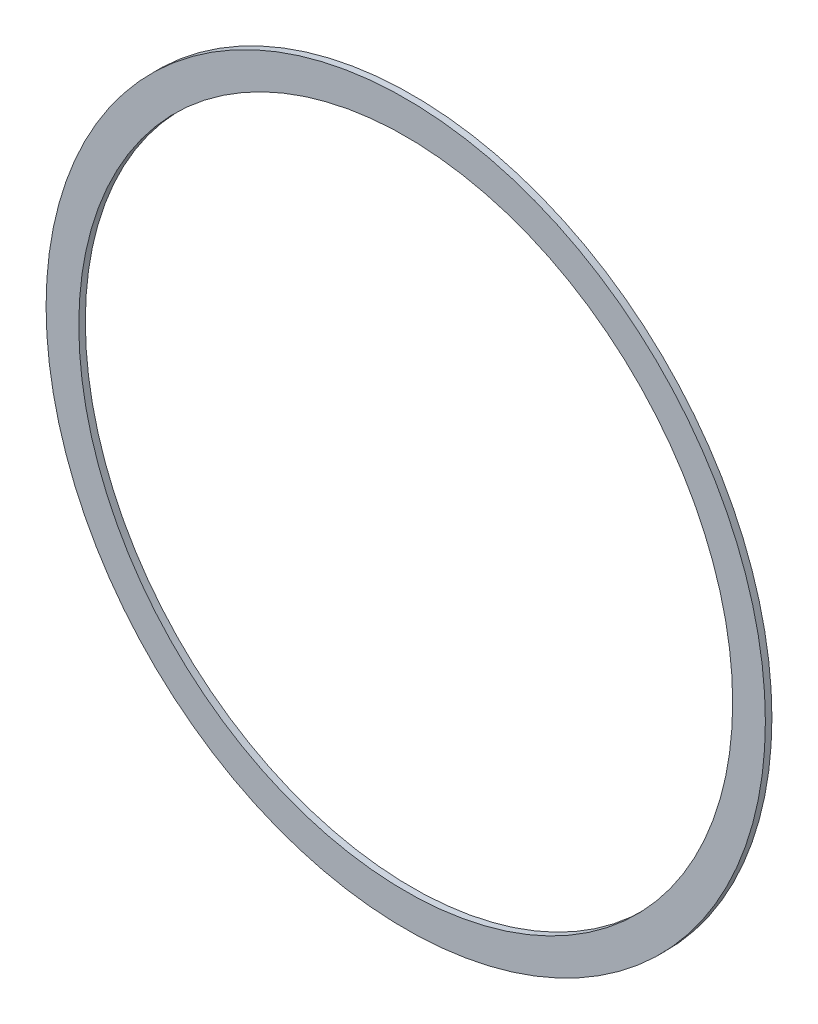
ISO-10303-21;
HEADER;
FILE_DESCRIPTION(('STEP AP214'),'2;1');
FILE_NAME('part.step','',(''),(''),'','','');
FILE_SCHEMA(('AUTOMOTIVE_DESIGN { 1 0 10303 214 1 1 1 1 }'));
ENDSEC;
DATA;
#1=APPLICATION_CONTEXT('core data for automotive mechanical design processes');
#2=APPLICATION_PROTOCOL_DEFINITION('international standard','automotive_design',2000,#1);
#3=PRODUCT_CONTEXT('',#1,'mechanical');
#4=PRODUCT('Part','Part','',(#3));
#5=PRODUCT_RELATED_PRODUCT_CATEGORY('part','',(#4));
#6=PRODUCT_DEFINITION_FORMATION('','',#4);
#7=PRODUCT_DEFINITION_CONTEXT('part definition',#1,'design');
#8=PRODUCT_DEFINITION('design','',#6,#7);
#9=PRODUCT_DEFINITION_SHAPE('','',#8);
#10=(LENGTH_UNIT() NAMED_UNIT(*) SI_UNIT(.MILLI.,.METRE.));
#11=(NAMED_UNIT(*) PLANE_ANGLE_UNIT() SI_UNIT($,.RADIAN.));
#12=(NAMED_UNIT(*) SI_UNIT($,.STERADIAN.) SOLID_ANGLE_UNIT());
#13=UNCERTAINTY_MEASURE_WITH_UNIT(LENGTH_MEASURE(1.E-05),#10,'distance_accuracy_value','');
#14=(GEOMETRIC_REPRESENTATION_CONTEXT(3) GLOBAL_UNCERTAINTY_ASSIGNED_CONTEXT((#13)) GLOBAL_UNIT_ASSIGNED_CONTEXT((#10,
#11,#12)) REPRESENTATION_CONTEXT('',''));
#15=CARTESIAN_POINT('',(0.,0.,0.));
#16=DIRECTION('',(0.,0.,1.));
#17=DIRECTION('',(1.,0.,0.));
#18=AXIS2_PLACEMENT_3D('',#15,#16,#17);
#19=CARTESIAN_POINT('',(38.0440382610875,18.9740938109529,1.6));
#20=DIRECTION('',(0.,0.,1.));
#21=DIRECTION('',(1.,0.,0.));
#22=AXIS2_PLACEMENT_3D('',#19,#20,#21);
#23=PLANE('',#22);
#24=CARTESIAN_POINT('',(38.0440382610875,18.9740938109529,1.6));
#25=DIRECTION('',(0.,0.,-1.));
#26=DIRECTION('',(-1.,0.,0.));
#27=AXIS2_PLACEMENT_3D('',#24,#25,#26);
#28=CIRCLE('',#27,2.5);
#29=CARTESIAN_POINT('',(40.5440382610875,18.9740938109529,1.6));
#30=VERTEX_POINT('',#29);
#31=EDGE_CURVE('E19',#30,#30,#28,.T.);
#32=ORIENTED_EDGE('',*,*,#31,.F.);
#33=EDGE_LOOP('',(#32));
#34=FACE_BOUND('',#33,.T.);
#35=CARTESIAN_POINT('',(38.0440382610875,18.9740938109529,1.6));
#36=DIRECTION('',(0.,0.,1.));
#37=DIRECTION('',(-1.,0.,0.));
#38=AXIS2_PLACEMENT_3D('',#35,#36,#37);
#39=CIRCLE('',#38,2.75);
#40=CARTESIAN_POINT('',(40.7940382610875,18.9740938109529,1.6));
#41=VERTEX_POINT('',#40);
#42=EDGE_CURVE('E11',#41,#41,#39,.T.);
#43=ORIENTED_EDGE('',*,*,#42,.F.);
#44=EDGE_LOOP('',(#43));
#45=FACE_BOUND('',#44,.T.);
#46=ADVANCED_FACE('F16',(#34,#45),#23,.F.);
#47=CARTESIAN_POINT('',(38.0440382610875,18.9740938109529,1.65));
#48=DIRECTION('',(0.,0.,1.));
#49=DIRECTION('',(1.,0.,0.));
#50=AXIS2_PLACEMENT_3D('',#47,#48,#49);
#51=PLANE('',#50);
#52=CARTESIAN_POINT('',(38.0440382610875,18.9740938109529,1.65));
#53=DIRECTION('',(0.,0.,-1.));
#54=DIRECTION('',(-1.,0.,0.));
#55=AXIS2_PLACEMENT_3D('',#52,#53,#54);
#56=CIRCLE('',#55,2.5);
#57=CARTESIAN_POINT('',(40.5440382610875,18.9740938109529,1.65));
#58=VERTEX_POINT('',#57);
#59=EDGE_CURVE('E56',#58,#58,#56,.T.);
#60=ORIENTED_EDGE('',*,*,#59,.T.);
#61=EDGE_LOOP('',(#60));
#62=FACE_BOUND('',#61,.T.);
#63=CARTESIAN_POINT('',(38.0440382610875,18.9740938109529,1.65));
#64=DIRECTION('',(0.,0.,1.));
#65=DIRECTION('',(-1.,0.,0.));
#66=AXIS2_PLACEMENT_3D('',#63,#64,#65);
#67=CIRCLE('',#66,2.75);
#68=CARTESIAN_POINT('',(40.7940382610875,18.9740938109529,1.65));
#69=VERTEX_POINT('',#68);
#70=EDGE_CURVE('E68',#69,#69,#67,.T.);
#71=ORIENTED_EDGE('',*,*,#70,.T.);
#72=EDGE_LOOP('',(#71));
#73=FACE_BOUND('',#72,.T.);
#74=ADVANCED_FACE('F61',(#62,#73),#51,.T.);
#75=CARTESIAN_POINT('',(38.0440382610875,18.9740938109529,1.6));
#76=DIRECTION('',(0.,0.,1.));
#77=DIRECTION('',(-1.,0.,0.));
#78=AXIS2_PLACEMENT_3D('',#75,#76,#77);
#79=CYLINDRICAL_SURFACE('',#78,2.75);
#80=ORIENTED_EDGE('',*,*,#70,.F.);
#81=DIRECTION('',(0.,0.,-1.));
#82=VECTOR('',#81,1.);
#83=CARTESIAN_POINT('',(40.7940382610875,18.9740938109529,1.6));
#84=LINE('',#83,#82);
#85=EDGE_CURVE('E25',#69,#41,#84,.T.);
#86=ORIENTED_EDGE('',*,*,#85,.T.);
#87=ORIENTED_EDGE('',*,*,#42,.T.);
#88=ORIENTED_EDGE('',*,*,#85,.F.);
#89=EDGE_LOOP('',(#80,#86,#87,#88));
#90=FACE_BOUND('',#89,.T.);
#91=ADVANCED_FACE('F74',(#90),#79,.T.);
#92=CARTESIAN_POINT('',(38.0440382610875,18.9740938109529,1.6));
#93=DIRECTION('',(0.,0.,1.));
#94=DIRECTION('',(-1.,0.,0.));
#95=AXIS2_PLACEMENT_3D('',#92,#93,#94);
#96=CYLINDRICAL_SURFACE('',#95,2.5);
#97=ORIENTED_EDGE('',*,*,#59,.F.);
#98=DIRECTION('',(0.,0.,-1.));
#99=VECTOR('',#98,1.);
#100=CARTESIAN_POINT('',(40.5440382610875,18.9740938109529,1.6));
#101=LINE('',#100,#99);
#102=EDGE_CURVE('E53',#58,#30,#101,.T.);
#103=ORIENTED_EDGE('',*,*,#102,.T.);
#104=ORIENTED_EDGE('',*,*,#31,.T.);
#105=ORIENTED_EDGE('',*,*,#102,.F.);
#106=EDGE_LOOP('',(#97,#103,#104,#105));
#107=FACE_BOUND('',#106,.T.);
#108=ADVANCED_FACE('F55',(#107),#96,.F.);
#109=CLOSED_SHELL('',(#46,#74,#91,#108));
#110=MANIFOLD_SOLID_BREP('B1',#109);
#111=ADVANCED_BREP_SHAPE_REPRESENTATION('',(#18,#110),#14);
#112=SHAPE_DEFINITION_REPRESENTATION(#9,#111);
ENDSEC;
END-ISO-10303-21;
